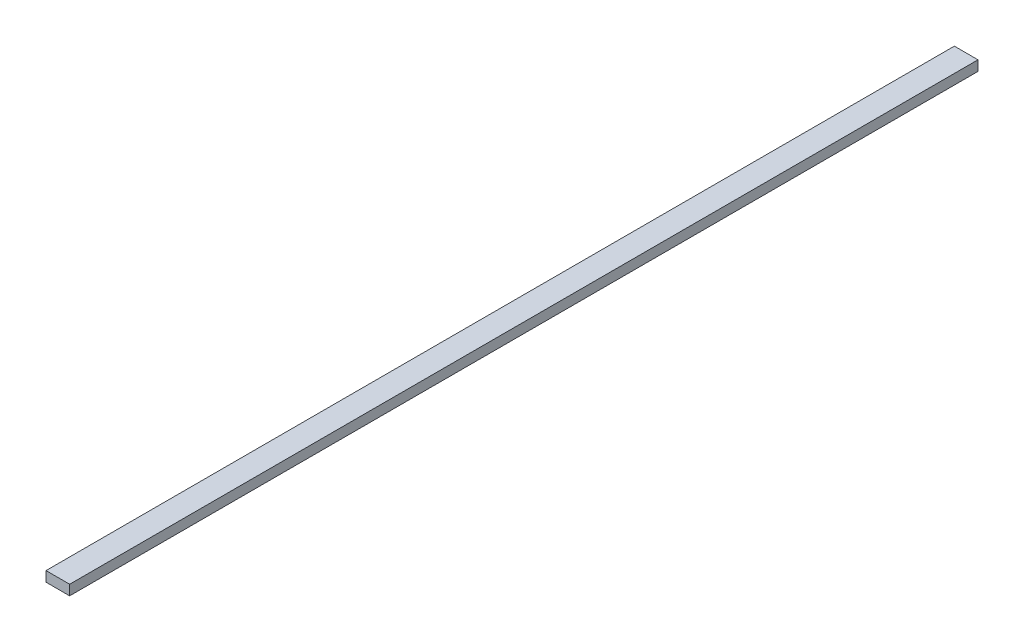
ISO-10303-21;
HEADER;
FILE_DESCRIPTION(('STEP AP214'),'2;1');
FILE_NAME('part.step','',(''),(''),'','','');
FILE_SCHEMA(('AUTOMOTIVE_DESIGN { 1 0 10303 214 1 1 1 1 }'));
ENDSEC;
DATA;
#1=APPLICATION_CONTEXT('core data for automotive mechanical design processes');
#2=APPLICATION_PROTOCOL_DEFINITION('international standard','automotive_design',2000,#1);
#3=PRODUCT_CONTEXT('',#1,'mechanical');
#4=PRODUCT('Part','Part','',(#3));
#5=PRODUCT_RELATED_PRODUCT_CATEGORY('part','',(#4));
#6=PRODUCT_DEFINITION_FORMATION('','',#4);
#7=PRODUCT_DEFINITION_CONTEXT('part definition',#1,'design');
#8=PRODUCT_DEFINITION('design','',#6,#7);
#9=PRODUCT_DEFINITION_SHAPE('','',#8);
#10=(LENGTH_UNIT() NAMED_UNIT(*) SI_UNIT(.MILLI.,.METRE.));
#11=(NAMED_UNIT(*) PLANE_ANGLE_UNIT() SI_UNIT($,.RADIAN.));
#12=(NAMED_UNIT(*) SI_UNIT($,.STERADIAN.) SOLID_ANGLE_UNIT());
#13=UNCERTAINTY_MEASURE_WITH_UNIT(LENGTH_MEASURE(1.E-05),#10,'distance_accuracy_value','');
#14=(GEOMETRIC_REPRESENTATION_CONTEXT(3) GLOBAL_UNCERTAINTY_ASSIGNED_CONTEXT((#13)) GLOBAL_UNIT_ASSIGNED_CONTEXT((#10,
#11,#12)) REPRESENTATION_CONTEXT('',''));
#15=CARTESIAN_POINT('',(0.,0.,0.));
#16=DIRECTION('',(0.,0.,1.));
#17=DIRECTION('',(1.,0.,0.));
#18=AXIS2_PLACEMENT_3D('',#15,#16,#17);
#19=CARTESIAN_POINT('',(-99.825,-7.358165587086,9.4));
#20=DIRECTION('',(0.,1.,0.));
#21=DIRECTION('',(0.,0.,1.));
#22=AXIS2_PLACEMENT_3D('',#19,#20,#21);
#23=PLANE('',#22);
#24=DIRECTION('',(1.,0.,0.));
#25=VECTOR('',#24,1.);
#26=CARTESIAN_POINT('',(-99.825,-7.358165587086,-66.48173829976));
#27=LINE('',#26,#25);
#28=CARTESIAN_POINT('',(-97.85,-7.358165587086,-66.48173829976));
#29=VERTEX_POINT('',#28);
#30=CARTESIAN_POINT('',(-101.8,-7.358165587086,-66.48173829976));
#31=VERTEX_POINT('',#30);
#32=EDGE_CURVE('E20',#29,#31,#27,.F.);
#33=ORIENTED_EDGE('',*,*,#32,.T.);
#34=DIRECTION('',(0.,0.,1.));
#35=VECTOR('',#34,1.);
#36=CARTESIAN_POINT('',(-101.8,-7.358165587086,-68.8));
#37=LINE('',#36,#35);
#38=CARTESIAN_POINT('',(-101.8,-7.358165587086,85.2817382997597));
#39=VERTEX_POINT('',#38);
#40=EDGE_CURVE('E80',#39,#31,#37,.F.);
#41=ORIENTED_EDGE('',*,*,#40,.F.);
#42=DIRECTION('',(1.,0.,2.590333011378E-13));
#43=VECTOR('',#42,1.);
#44=CARTESIAN_POINT('',(-99.825,-7.358165587086,85.28173829976));
#45=LINE('',#44,#43);
#46=CARTESIAN_POINT('',(-97.85,-7.358165587086,85.2817382997601));
#47=VERTEX_POINT('',#46);
#48=EDGE_CURVE('E61',#47,#39,#45,.F.);
#49=ORIENTED_EDGE('',*,*,#48,.F.);
#50=DIRECTION('',(0.,0.,1.));
#51=VECTOR('',#50,1.);
#52=CARTESIAN_POINT('',(-97.85,-7.358165587086,-68.8));
#53=LINE('',#52,#51);
#54=EDGE_CURVE('E55',#47,#29,#53,.F.);
#55=ORIENTED_EDGE('',*,*,#54,.T.);
#56=EDGE_LOOP('',(#33,#41,#49,#55));
#57=FACE_BOUND('',#56,.T.);
#58=ADVANCED_FACE('F17',(#57),#23,.T.);
#59=CARTESIAN_POINT('',(-99.825,-8.200000000023,-66.48173829976));
#60=DIRECTION('',(0.,0.,1.));
#61=DIRECTION('',(1.,0.,0.));
#62=AXIS2_PLACEMENT_3D('',#59,#60,#61);
#63=PLANE('',#62);
#64=DIRECTION('',(0.,1.,0.));
#65=VECTOR('',#64,1.);
#66=CARTESIAN_POINT('',(-97.85,-54.,-66.48173829976));
#67=LINE('',#66,#65);
#68=CARTESIAN_POINT('',(-97.85,-9.04183441296895,-66.48173829976));
#69=VERTEX_POINT('',#68);
#70=EDGE_CURVE('E63',#29,#69,#67,.F.);
#71=ORIENTED_EDGE('',*,*,#70,.T.);
#72=DIRECTION('',(1.,7.693199101676E-12,0.));
#73=VECTOR('',#72,1.);
#74=CARTESIAN_POINT('',(-99.825,-9.041834412976,-66.48173829976));
#75=LINE('',#74,#73);
#76=CARTESIAN_POINT('',(-101.8,-9.0418344129798,-66.48173829976));
#77=VERTEX_POINT('',#76);
#78=EDGE_CURVE('E83',#77,#69,#75,.T.);
#79=ORIENTED_EDGE('',*,*,#78,.F.);
#80=DIRECTION('',(0.,1.,0.));
#81=VECTOR('',#80,1.);
#82=CARTESIAN_POINT('',(-101.8,-54.,-66.48173829976));
#83=LINE('',#82,#81);
#84=EDGE_CURVE('E68',#31,#77,#83,.F.);
#85=ORIENTED_EDGE('',*,*,#84,.F.);
#86=ORIENTED_EDGE('',*,*,#32,.F.);
#87=EDGE_LOOP('',(#71,#79,#85,#86));
#88=FACE_BOUND('',#87,.T.);
#89=ADVANCED_FACE('F65',(#88),#63,.F.);
#90=CARTESIAN_POINT('',(-97.85,-54.,-68.8));
#91=DIRECTION('',(-1.,0.,0.));
#92=DIRECTION('',(0.,0.,1.));
#93=AXIS2_PLACEMENT_3D('',#90,#91,#92);
#94=PLANE('',#93);
#95=ORIENTED_EDGE('',*,*,#54,.F.);
#96=DIRECTION('',(0.,1.,0.));
#97=VECTOR('',#96,1.);
#98=CARTESIAN_POINT('',(-97.85,-8.200000000029,85.2817382997605));
#99=LINE('',#98,#97);
#100=CARTESIAN_POINT('',(-97.85,-9.0418344129657,85.2817382997601));
#101=VERTEX_POINT('',#100);
#102=EDGE_CURVE('E74',#101,#47,#99,.T.);
#103=ORIENTED_EDGE('',*,*,#102,.F.);
#104=DIRECTION('',(0.,0.,1.));
#105=VECTOR('',#104,1.);
#106=CARTESIAN_POINT('',(-97.85,-9.0418344129608,9.400000000001));
#107=LINE('',#106,#105);
#108=EDGE_CURVE('E72',#69,#101,#107,.T.);
#109=ORIENTED_EDGE('',*,*,#108,.F.);
#110=ORIENTED_EDGE('',*,*,#70,.F.);
#111=EDGE_LOOP('',(#95,#103,#109,#110));
#112=FACE_BOUND('',#111,.T.);
#113=ADVANCED_FACE('F70',(#112),#94,.F.);
#114=CARTESIAN_POINT('',(-99.825,-8.200000000029,85.28173829976));
#115=DIRECTION('',(-2.590333011378E-13,0.,1.));
#116=DIRECTION('',(1.,0.,2.590333011378E-13));
#117=AXIS2_PLACEMENT_3D('',#114,#115,#116);
#118=PLANE('',#117);
#119=ORIENTED_EDGE('',*,*,#48,.T.);
#120=DIRECTION('',(0.,1.,0.));
#121=VECTOR('',#120,1.);
#122=CARTESIAN_POINT('',(-101.8,-54.,85.28173829976));
#123=LINE('',#122,#121);
#124=CARTESIAN_POINT('',(-101.8,-9.0418344129798,85.2817382997597));
#125=VERTEX_POINT('',#124);
#126=EDGE_CURVE('E35',#125,#39,#123,.T.);
#127=ORIENTED_EDGE('',*,*,#126,.F.);
#128=DIRECTION('',(1.,7.693199101676E-12,0.));
#129=VECTOR('',#128,1.);
#130=CARTESIAN_POINT('',(-99.825,-9.041834412976,85.28173829976));
#131=LINE('',#130,#129);
#132=EDGE_CURVE('E26',#101,#125,#131,.F.);
#133=ORIENTED_EDGE('',*,*,#132,.F.);
#134=ORIENTED_EDGE('',*,*,#102,.T.);
#135=EDGE_LOOP('',(#119,#127,#133,#134));
#136=FACE_BOUND('',#135,.T.);
#137=ADVANCED_FACE('F89',(#136),#118,.T.);
#138=CARTESIAN_POINT('',(-101.8,-54.,-68.8));
#139=DIRECTION('',(-1.,0.,0.));
#140=DIRECTION('',(0.,0.,1.));
#141=AXIS2_PLACEMENT_3D('',#138,#139,#140);
#142=PLANE('',#141);
#143=ORIENTED_EDGE('',*,*,#84,.T.);
#144=DIRECTION('',(0.,0.,1.));
#145=VECTOR('',#144,1.);
#146=CARTESIAN_POINT('',(-101.8,-9.04183441299119,9.400000000001));
#147=LINE('',#146,#145);
#148=EDGE_CURVE('E11',#125,#77,#147,.F.);
#149=ORIENTED_EDGE('',*,*,#148,.F.);
#150=ORIENTED_EDGE('',*,*,#126,.T.);
#151=ORIENTED_EDGE('',*,*,#40,.T.);
#152=EDGE_LOOP('',(#143,#149,#150,#151));
#153=FACE_BOUND('',#152,.T.);
#154=ADVANCED_FACE('F91',(#153),#142,.T.);
#155=CARTESIAN_POINT('',(-99.825,-9.041834412976,9.400000000001));
#156=DIRECTION('',(7.693199101676E-12,-1.,0.));
#157=DIRECTION('',(1.,7.693199101676E-12,0.));
#158=AXIS2_PLACEMENT_3D('',#155,#156,#157);
#159=PLANE('',#158);
#160=ORIENTED_EDGE('',*,*,#132,.T.);
#161=ORIENTED_EDGE('',*,*,#148,.T.);
#162=ORIENTED_EDGE('',*,*,#78,.T.);
#163=ORIENTED_EDGE('',*,*,#108,.T.);
#164=EDGE_LOOP('',(#160,#161,#162,#163));
#165=FACE_BOUND('',#164,.T.);
#166=ADVANCED_FACE('F88',(#165),#159,.T.);
#167=CLOSED_SHELL('',(#58,#89,#113,#137,#154,#166));
#168=MANIFOLD_SOLID_BREP('B1',#167);
#169=ADVANCED_BREP_SHAPE_REPRESENTATION('',(#18,#168),#14);
#170=SHAPE_DEFINITION_REPRESENTATION(#9,#169);
ENDSEC;
END-ISO-10303-21;
